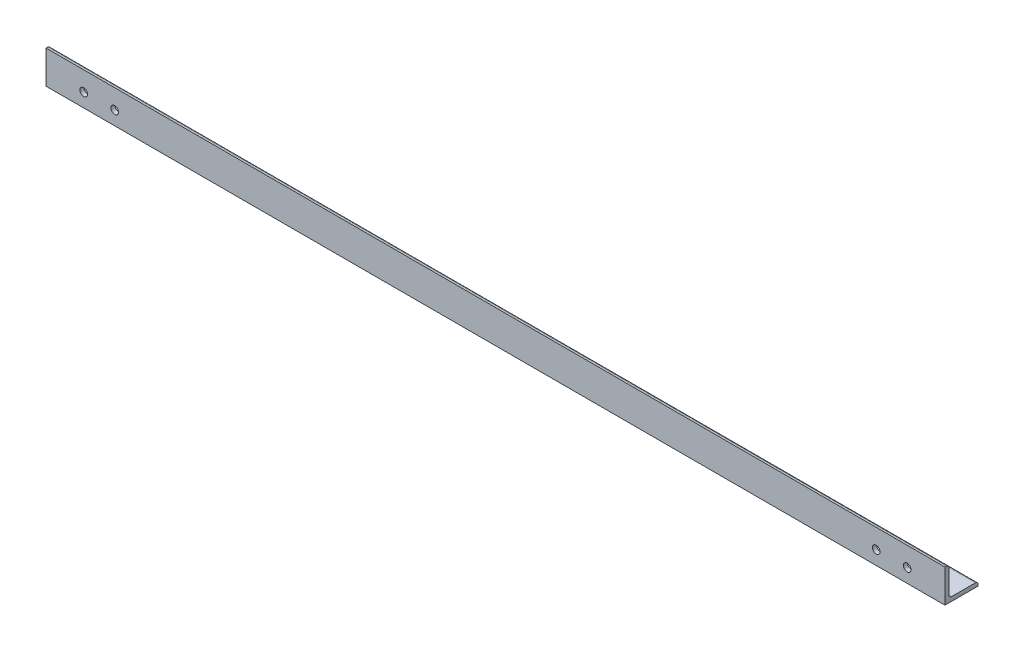
ISO-10303-21;
HEADER;
FILE_DESCRIPTION(('STEP AP214'),'2;1');
FILE_NAME('part.step','',(''),(''),'','','');
FILE_SCHEMA(('AUTOMOTIVE_DESIGN { 1 0 10303 214 1 1 1 1 }'));
ENDSEC;
DATA;
#1=APPLICATION_CONTEXT('core data for automotive mechanical design processes');
#2=APPLICATION_PROTOCOL_DEFINITION('international standard','automotive_design',2000,#1);
#3=PRODUCT_CONTEXT('',#1,'mechanical');
#4=PRODUCT('Part','Part','',(#3));
#5=PRODUCT_RELATED_PRODUCT_CATEGORY('part','',(#4));
#6=PRODUCT_DEFINITION_FORMATION('','',#4);
#7=PRODUCT_DEFINITION_CONTEXT('part definition',#1,'design');
#8=PRODUCT_DEFINITION('design','',#6,#7);
#9=PRODUCT_DEFINITION_SHAPE('','',#8);
#10=(LENGTH_UNIT() NAMED_UNIT(*) SI_UNIT(.MILLI.,.METRE.));
#11=(NAMED_UNIT(*) PLANE_ANGLE_UNIT() SI_UNIT($,.RADIAN.));
#12=(NAMED_UNIT(*) SI_UNIT($,.STERADIAN.) SOLID_ANGLE_UNIT());
#13=UNCERTAINTY_MEASURE_WITH_UNIT(LENGTH_MEASURE(1.E-05),#10,'distance_accuracy_value','');
#14=(GEOMETRIC_REPRESENTATION_CONTEXT(3) GLOBAL_UNCERTAINTY_ASSIGNED_CONTEXT((#13)) GLOBAL_UNIT_ASSIGNED_CONTEXT((#10,
#11,#12)) REPRESENTATION_CONTEXT('',''));
#15=CARTESIAN_POINT('',(0.,0.,0.));
#16=DIRECTION('',(0.,0.,1.));
#17=DIRECTION('',(1.,0.,0.));
#18=AXIS2_PLACEMENT_3D('',#15,#16,#17);
#19=CARTESIAN_POINT('',(-70.4893476114889,-310.689072168843,-671.1));
#20=DIRECTION('',(0.,-1.,0.));
#21=DIRECTION('',(0.,0.,-1.));
#22=AXIS2_PLACEMENT_3D('',#19,#20,#21);
#23=CYLINDRICAL_SURFACE('',#22,3.4);
#24=CARTESIAN_POINT('',(-70.4893476114889,-305.926572168843,-671.1));
#25=DIRECTION('',(0.,-1.,0.));
#26=DIRECTION('',(0.,0.,-1.));
#27=AXIS2_PLACEMENT_3D('',#24,#25,#26);
#28=CIRCLE('',#27,3.4);
#29=CARTESIAN_POINT('',(-70.4893476114889,-305.926572168843,-674.5));
#30=VERTEX_POINT('',#29);
#31=EDGE_CURVE('E20',#30,#30,#28,.F.);
#32=ORIENTED_EDGE('',*,*,#31,.T.);
#33=EDGE_LOOP('',(#32));
#34=FACE_BOUND('',#33,.T.);
#35=CARTESIAN_POINT('',(-70.4893476114889,-310.017902480865,-671.1));
#36=DIRECTION('',(0.,-1.,0.));
#37=DIRECTION('',(-1.,0.,0.));
#38=AXIS2_PLACEMENT_3D('',#35,#36,#37);
#39=CIRCLE('',#38,3.40000000000923);
#40=CARTESIAN_POINT('',(-73.8893476114981,-310.017902480865,-671.1));
#41=VERTEX_POINT('',#40);
#42=EDGE_CURVE('E124',#41,#41,#39,.T.);
#43=ORIENTED_EDGE('',*,*,#42,.T.);
#44=EDGE_LOOP('',(#43));
#45=FACE_BOUND('',#44,.T.);
#46=ADVANCED_FACE('F17',(#34,#45),#23,.F.);
#47=CARTESIAN_POINT('',(0.,-275.589072168843,-653.8125));
#48=DIRECTION('',(1.,0.,0.));
#49=DIRECTION('',(0.,0.,-1.));
#50=AXIS2_PLACEMENT_3D('',#47,#48,#49);
#51=CYLINDRICAL_SURFACE('',#50,3.);
#52=DIRECTION('',(1.,0.,0.));
#53=VECTOR('',#52,1.);
#54=CARTESIAN_POINT('',(551.510652388512,-272.589072168843,-653.8125));
#55=LINE('',#54,#53);
#56=CARTESIAN_POINT('',(-861.589347611489,-272.589072168843,-653.8125));
#57=VERTEX_POINT('',#56);
#58=CARTESIAN_POINT('',(174.610652388511,-272.589072168843,-653.8125));
#59=VERTEX_POINT('',#58);
#60=EDGE_CURVE('E130',#57,#59,#55,.T.);
#61=ORIENTED_EDGE('',*,*,#60,.T.);
#62=CARTESIAN_POINT('',(174.610652388511,-275.589072168843,-653.8125));
#63=DIRECTION('',(1.,0.,0.));
#64=DIRECTION('',(0.,0.,-1.));
#65=AXIS2_PLACEMENT_3D('',#62,#63,#64);
#66=CIRCLE('',#65,3.);
#67=CARTESIAN_POINT('',(174.610652388511,-275.589072168843,-656.8125));
#68=VERTEX_POINT('',#67);
#69=EDGE_CURVE('E115',#68,#59,#66,.T.);
#70=ORIENTED_EDGE('',*,*,#69,.F.);
#71=DIRECTION('',(1.,0.,0.));
#72=VECTOR('',#71,1.);
#73=CARTESIAN_POINT('',(551.510652388512,-275.589072168843,-656.8125));
#74=LINE('',#73,#72);
#75=CARTESIAN_POINT('',(-861.589347611489,-275.589072168843,-656.8125));
#76=VERTEX_POINT('',#75);
#77=EDGE_CURVE('E101',#68,#76,#74,.F.);
#78=ORIENTED_EDGE('',*,*,#77,.T.);
#79=CARTESIAN_POINT('',(-861.589347611489,-275.589072168843,-653.8125));
#80=DIRECTION('',(1.,0.,0.));
#81=DIRECTION('',(0.,0.,-1.));
#82=AXIS2_PLACEMENT_3D('',#79,#80,#81);
#83=CIRCLE('',#82,3.);
#84=EDGE_CURVE('E200',#57,#76,#83,.F.);
#85=ORIENTED_EDGE('',*,*,#84,.F.);
#86=EDGE_LOOP('',(#61,#70,#78,#85));
#87=FACE_BOUND('',#86,.T.);
#88=ADVANCED_FACE('F286',(#87),#51,.T.);
#89=CARTESIAN_POINT('',(551.510652388512,-272.589072168843,-656.8125));
#90=DIRECTION('',(0.,0.,1.));
#91=DIRECTION('',(1.,0.,0.));
#92=AXIS2_PLACEMENT_3D('',#89,#90,#91);
#93=PLANE('',#92);
#94=DIRECTION('',(0.,1.,0.));
#95=VECTOR('',#94,1.);
#96=CARTESIAN_POINT('',(174.610652388511,-310.689072168843,-656.8125));
#97=LINE('',#96,#95);
#98=CARTESIAN_POINT('',(174.610652388511,-302.926572168843,-656.8125));
#99=VERTEX_POINT('',#98);
#100=EDGE_CURVE('E107',#99,#68,#97,.T.);
#101=ORIENTED_EDGE('',*,*,#100,.F.);
#102=DIRECTION('',(-1.,0.,0.));
#103=VECTOR('',#102,1.);
#104=CARTESIAN_POINT('',(0.,-302.926572168843,-656.8125));
#105=LINE('',#104,#103);
#106=CARTESIAN_POINT('',(-861.589347611489,-302.926572168843,-656.8125));
#107=VERTEX_POINT('',#106);
#108=EDGE_CURVE('E93',#99,#107,#105,.T.);
#109=ORIENTED_EDGE('',*,*,#108,.T.);
#110=DIRECTION('',(0.,1.,0.));
#111=VECTOR('',#110,1.);
#112=CARTESIAN_POINT('',(-861.589347611489,-310.689072168843,-656.8125));
#113=LINE('',#112,#111);
#114=EDGE_CURVE('E199',#76,#107,#113,.F.);
#115=ORIENTED_EDGE('',*,*,#114,.F.);
#116=ORIENTED_EDGE('',*,*,#77,.F.);
#117=EDGE_LOOP('',(#101,#109,#115,#116));
#118=FACE_BOUND('',#117,.T.);
#119=CARTESIAN_POINT('',(95.3856523885109,-294.826572168843,-656.8125));
#120=DIRECTION('',(0.,0.,-1.));
#121=DIRECTION('',(-1.,0.,0.));
#122=AXIS2_PLACEMENT_3D('',#119,#120,#121);
#123=CIRCLE('',#122,4.4);
#124=CARTESIAN_POINT('',(90.9856523885109,-294.826572168843,-656.8125));
#125=VERTEX_POINT('',#124);
#126=EDGE_CURVE('E134',#125,#125,#123,.F.);
#127=ORIENTED_EDGE('',*,*,#126,.T.);
#128=EDGE_LOOP('',(#127));
#129=FACE_BOUND('',#128,.T.);
#130=CARTESIAN_POINT('',(131.135652388511,-294.826572168843,-656.8125));
#131=DIRECTION('',(0.,0.,-1.));
#132=DIRECTION('',(-1.,0.,0.));
#133=AXIS2_PLACEMENT_3D('',#130,#131,#132);
#134=CIRCLE('',#133,4.4);
#135=CARTESIAN_POINT('',(126.735652388511,-294.826572168843,-656.8125));
#136=VERTEX_POINT('',#135);
#137=EDGE_CURVE('E127',#136,#136,#134,.F.);
#138=ORIENTED_EDGE('',*,*,#137,.T.);
#139=EDGE_LOOP('',(#138));
#140=FACE_BOUND('',#139,.T.);
#141=CARTESIAN_POINT('',(-782.364347611488,-294.826572168843,-656.8125));
#142=DIRECTION('',(0.,0.,1.));
#143=DIRECTION('',(1.,0.,0.));
#144=AXIS2_PLACEMENT_3D('',#141,#142,#143);
#145=CIRCLE('',#144,4.4);
#146=CARTESIAN_POINT('',(-777.964347611488,-294.826572168843,-656.8125));
#147=VERTEX_POINT('',#146);
#148=EDGE_CURVE('E210',#147,#147,#145,.T.);
#149=ORIENTED_EDGE('',*,*,#148,.T.);
#150=EDGE_LOOP('',(#149));
#151=FACE_BOUND('',#150,.T.);
#152=CARTESIAN_POINT('',(-818.114347611488,-294.826572168843,-656.8125));
#153=DIRECTION('',(0.,0.,1.));
#154=DIRECTION('',(1.,0.,0.));
#155=AXIS2_PLACEMENT_3D('',#152,#153,#154);
#156=CIRCLE('',#155,4.4);
#157=CARTESIAN_POINT('',(-813.714347611488,-294.826572168843,-656.8125));
#158=VERTEX_POINT('',#157);
#159=EDGE_CURVE('E213',#158,#158,#156,.T.);
#160=ORIENTED_EDGE('',*,*,#159,.T.);
#161=EDGE_LOOP('',(#160));
#162=FACE_BOUND('',#161,.T.);
#163=ADVANCED_FACE('F112',(#118,#129,#140,#151,#162),#93,.F.);
#164=CARTESIAN_POINT('',(0.,-302.926572168843,-659.8125));
#165=DIRECTION('',(-1.,0.,0.));
#166=DIRECTION('',(0.,0.,1.));
#167=AXIS2_PLACEMENT_3D('',#164,#165,#166);
#168=CYLINDRICAL_SURFACE('',#167,3.);
#169=CARTESIAN_POINT('',(-861.589347611489,-302.926572168843,-659.8125));
#170=DIRECTION('',(-1.,0.,0.));
#171=DIRECTION('',(0.,0.,1.));
#172=AXIS2_PLACEMENT_3D('',#169,#170,#171);
#173=CIRCLE('',#172,3.);
#174=CARTESIAN_POINT('',(-861.589347611489,-305.926572168843,-659.8125));
#175=VERTEX_POINT('',#174);
#176=EDGE_CURVE('E97',#107,#175,#173,.F.);
#177=ORIENTED_EDGE('',*,*,#176,.F.);
#178=ORIENTED_EDGE('',*,*,#108,.F.);
#179=CARTESIAN_POINT('',(174.610652388511,-302.926572168843,-659.8125));
#180=DIRECTION('',(-1.,0.,0.));
#181=DIRECTION('',(0.,0.,1.));
#182=AXIS2_PLACEMENT_3D('',#179,#180,#181);
#183=CIRCLE('',#182,3.);
#184=CARTESIAN_POINT('',(174.610652388511,-305.926572168843,-659.8125));
#185=VERTEX_POINT('',#184);
#186=EDGE_CURVE('E96',#185,#99,#183,.T.);
#187=ORIENTED_EDGE('',*,*,#186,.F.);
#188=DIRECTION('',(1.,0.,0.));
#189=VECTOR('',#188,1.);
#190=CARTESIAN_POINT('',(551.510652388512,-305.926572168843,-659.8125));
#191=LINE('',#190,#189);
#192=EDGE_CURVE('E86',#185,#175,#191,.F.);
#193=ORIENTED_EDGE('',*,*,#192,.T.);
#194=EDGE_LOOP('',(#177,#178,#187,#193));
#195=FACE_BOUND('',#194,.T.);
#196=ADVANCED_FACE('F95',(#195),#168,.F.);
#197=CARTESIAN_POINT('',(551.510652388512,-305.926572168843,-656.8125));
#198=DIRECTION('',(0.,-1.,0.));
#199=DIRECTION('',(0.,0.,-1.));
#200=AXIS2_PLACEMENT_3D('',#197,#198,#199);
#201=PLANE('',#200);
#202=DIRECTION('',(0.,0.,-1.));
#203=VECTOR('',#202,1.);
#204=CARTESIAN_POINT('',(174.610652388511,-305.926572168843,-270.05));
#205=LINE('',#204,#203);
#206=CARTESIAN_POINT('',(174.610652388511,-305.926572168843,-687.15));
#207=VERTEX_POINT('',#206);
#208=EDGE_CURVE('E110',#207,#185,#205,.F.);
#209=ORIENTED_EDGE('',*,*,#208,.F.);
#210=DIRECTION('',(-1.,0.,0.));
#211=VECTOR('',#210,1.);
#212=CARTESIAN_POINT('',(0.,-305.926572168843,-687.15));
#213=LINE('',#212,#211);
#214=CARTESIAN_POINT('',(-861.589347611489,-305.926572168843,-687.15));
#215=VERTEX_POINT('',#214);
#216=EDGE_CURVE('E125',#215,#207,#213,.F.);
#217=ORIENTED_EDGE('',*,*,#216,.F.);
#218=DIRECTION('',(0.,0.,1.));
#219=VECTOR('',#218,1.);
#220=CARTESIAN_POINT('',(-861.589347611489,-305.926572168843,-793.95));
#221=LINE('',#220,#219);
#222=EDGE_CURVE('E197',#175,#215,#221,.F.);
#223=ORIENTED_EDGE('',*,*,#222,.F.);
#224=ORIENTED_EDGE('',*,*,#192,.F.);
#225=EDGE_LOOP('',(#209,#217,#223,#224));
#226=FACE_BOUND('',#225,.T.);
#227=CARTESIAN_POINT('',(-800.239347611488,-305.926572168843,-671.1));
#228=DIRECTION('',(0.,-1.,0.));
#229=DIRECTION('',(0.,0.,-1.));
#230=AXIS2_PLACEMENT_3D('',#227,#228,#229);
#231=CIRCLE('',#230,5.);
#232=CARTESIAN_POINT('',(-800.239347611488,-305.926572168843,-676.1));
#233=VERTEX_POINT('',#232);
#234=EDGE_CURVE('E175',#233,#233,#231,.T.);
#235=ORIENTED_EDGE('',*,*,#234,.T.);
#236=EDGE_LOOP('',(#235));
#237=FACE_BOUND('',#236,.T.);
#238=ORIENTED_EDGE('',*,*,#31,.F.);
#239=EDGE_LOOP('',(#238));
#240=FACE_BOUND('',#239,.T.);
#241=CARTESIAN_POINT('',(113.260652388512,-305.926572168843,-671.1));
#242=DIRECTION('',(0.,-1.,0.));
#243=DIRECTION('',(0.,0.,-1.));
#244=AXIS2_PLACEMENT_3D('',#241,#242,#243);
#245=CIRCLE('',#244,5.);
#246=CARTESIAN_POINT('',(113.260652388512,-305.926572168843,-676.1));
#247=VERTEX_POINT('',#246);
#248=EDGE_CURVE('E133',#247,#247,#245,.T.);
#249=ORIENTED_EDGE('',*,*,#248,.T.);
#250=EDGE_LOOP('',(#249));
#251=FACE_BOUND('',#250,.T.);
#252=ADVANCED_FACE('F279',(#226,#237,#240,#251),#201,.F.);
#253=CARTESIAN_POINT('',(0.,-308.926572168843,-687.15));
#254=DIRECTION('',(-1.,0.,0.));
#255=DIRECTION('',(0.,0.,1.));
#256=AXIS2_PLACEMENT_3D('',#253,#254,#255);
#257=CYLINDRICAL_SURFACE('',#256,3.);
#258=DIRECTION('',(1.,0.,0.));
#259=VECTOR('',#258,1.);
#260=CARTESIAN_POINT('',(551.510652388512,-308.926572168843,-690.15));
#261=LINE('',#260,#259);
#262=CARTESIAN_POINT('',(174.610652388511,-308.926572168843,-690.15));
#263=VERTEX_POINT('',#262);
#264=CARTESIAN_POINT('',(-861.589347611489,-308.926572168843,-690.15));
#265=VERTEX_POINT('',#264);
#266=EDGE_CURVE('E145',#263,#265,#261,.F.);
#267=ORIENTED_EDGE('',*,*,#266,.T.);
#268=CARTESIAN_POINT('',(-861.589347611489,-308.926572168843,-687.15));
#269=DIRECTION('',(-1.,0.,0.));
#270=DIRECTION('',(0.,0.,1.));
#271=AXIS2_PLACEMENT_3D('',#268,#269,#270);
#272=CIRCLE('',#271,3.);
#273=EDGE_CURVE('E194',#215,#265,#272,.T.);
#274=ORIENTED_EDGE('',*,*,#273,.F.);
#275=ORIENTED_EDGE('',*,*,#216,.T.);
#276=CARTESIAN_POINT('',(174.610652388511,-308.926572168843,-687.15));
#277=DIRECTION('',(-1.,0.,0.));
#278=DIRECTION('',(0.,0.,1.));
#279=AXIS2_PLACEMENT_3D('',#276,#277,#278);
#280=CIRCLE('',#279,3.);
#281=EDGE_CURVE('E160',#263,#207,#280,.F.);
#282=ORIENTED_EDGE('',*,*,#281,.F.);
#283=EDGE_LOOP('',(#267,#274,#275,#282));
#284=FACE_BOUND('',#283,.T.);
#285=ADVANCED_FACE('F224',(#284),#257,.T.);
#286=CARTESIAN_POINT('',(131.135652388511,-294.826572168843,-648.2399976));
#287=DIRECTION('',(0.,0.,-1.));
#288=DIRECTION('',(-1.,0.,0.));
#289=AXIS2_PLACEMENT_3D('',#286,#287,#288);
#290=CYLINDRICAL_SURFACE('',#289,4.4);
#291=ORIENTED_EDGE('',*,*,#137,.F.);
#292=EDGE_LOOP('',(#291));
#293=FACE_BOUND('',#292,.T.);
#294=CARTESIAN_POINT('',(131.135652388511,-294.826572168843,-652.05));
#295=DIRECTION('',(0.,0.,-1.));
#296=DIRECTION('',(-1.,0.,0.));
#297=AXIS2_PLACEMENT_3D('',#294,#295,#296);
#298=CIRCLE('',#297,4.4);
#299=CARTESIAN_POINT('',(126.735652388511,-294.826572168843,-652.05));
#300=VERTEX_POINT('',#299);
#301=EDGE_CURVE('E191',#300,#300,#298,.F.);
#302=ORIENTED_EDGE('',*,*,#301,.T.);
#303=EDGE_LOOP('',(#302));
#304=FACE_BOUND('',#303,.T.);
#305=ADVANCED_FACE('F220',(#293,#304),#290,.F.);
#306=CARTESIAN_POINT('',(-818.114347611488,-294.826572168843,-693.9600024));
#307=DIRECTION('',(0.,0.,1.));
#308=DIRECTION('',(1.,0.,0.));
#309=AXIS2_PLACEMENT_3D('',#306,#307,#308);
#310=CYLINDRICAL_SURFACE('',#309,4.4);
#311=CARTESIAN_POINT('',(-818.114347611488,-294.826572168843,-652.05));
#312=DIRECTION('',(0.,0.,1.));
#313=DIRECTION('',(1.,0.,0.));
#314=AXIS2_PLACEMENT_3D('',#311,#312,#313);
#315=CIRCLE('',#314,4.4);
#316=CARTESIAN_POINT('',(-813.714347611488,-294.826572168843,-652.05));
#317=VERTEX_POINT('',#316);
#318=EDGE_CURVE('E188',#317,#317,#315,.T.);
#319=ORIENTED_EDGE('',*,*,#318,.T.);
#320=EDGE_LOOP('',(#319));
#321=FACE_BOUND('',#320,.T.);
#322=ORIENTED_EDGE('',*,*,#159,.F.);
#323=EDGE_LOOP('',(#322));
#324=FACE_BOUND('',#323,.T.);
#325=ADVANCED_FACE('F223',(#321,#324),#310,.F.);
#326=CARTESIAN_POINT('',(-782.364347611488,-294.826572168843,-693.9600024));
#327=DIRECTION('',(0.,0.,1.));
#328=DIRECTION('',(1.,0.,0.));
#329=AXIS2_PLACEMENT_3D('',#326,#327,#328);
#330=CYLINDRICAL_SURFACE('',#329,4.4);
#331=CARTESIAN_POINT('',(-782.364347611488,-294.826572168843,-652.05));
#332=DIRECTION('',(0.,0.,1.));
#333=DIRECTION('',(1.,0.,0.));
#334=AXIS2_PLACEMENT_3D('',#331,#332,#333);
#335=CIRCLE('',#334,4.4);
#336=CARTESIAN_POINT('',(-777.964347611488,-294.826572168843,-652.05));
#337=VERTEX_POINT('',#336);
#338=EDGE_CURVE('E185',#337,#337,#335,.T.);
#339=ORIENTED_EDGE('',*,*,#338,.T.);
#340=EDGE_LOOP('',(#339));
#341=FACE_BOUND('',#340,.T.);
#342=ORIENTED_EDGE('',*,*,#148,.F.);
#343=EDGE_LOOP('',(#342));
#344=FACE_BOUND('',#343,.T.);
#345=ADVANCED_FACE('F269',(#341,#344),#330,.F.);
#346=CARTESIAN_POINT('',(95.3856523885109,-294.826572168843,-648.2399976));
#347=DIRECTION('',(0.,0.,-1.));
#348=DIRECTION('',(-1.,0.,0.));
#349=AXIS2_PLACEMENT_3D('',#346,#347,#348);
#350=CYLINDRICAL_SURFACE('',#349,4.4);
#351=ORIENTED_EDGE('',*,*,#126,.F.);
#352=EDGE_LOOP('',(#351));
#353=FACE_BOUND('',#352,.T.);
#354=CARTESIAN_POINT('',(95.3856523885109,-294.826572168843,-652.05));
#355=DIRECTION('',(0.,0.,-1.));
#356=DIRECTION('',(-1.,0.,0.));
#357=AXIS2_PLACEMENT_3D('',#354,#355,#356);
#358=CIRCLE('',#357,4.4);
#359=CARTESIAN_POINT('',(90.9856523885109,-294.826572168843,-652.05));
#360=VERTEX_POINT('',#359);
#361=EDGE_CURVE('E170',#360,#360,#358,.F.);
#362=ORIENTED_EDGE('',*,*,#361,.T.);
#363=EDGE_LOOP('',(#362));
#364=FACE_BOUND('',#363,.T.);
#365=ADVANCED_FACE('F265',(#353,#364),#350,.F.);
#366=CARTESIAN_POINT('',(551.510652388512,-272.589072168843,-652.05));
#367=DIRECTION('',(0.,-1.,0.));
#368=DIRECTION('',(0.,0.,-1.));
#369=AXIS2_PLACEMENT_3D('',#366,#367,#368);
#370=PLANE('',#369);
#371=DIRECTION('',(0.,0.,1.));
#372=VECTOR('',#371,1.);
#373=CARTESIAN_POINT('',(-861.589347611489,-272.589072168843,-793.95));
#374=LINE('',#373,#372);
#375=CARTESIAN_POINT('',(-861.589347611489,-272.589072168843,-652.05));
#376=VERTEX_POINT('',#375);
#377=EDGE_CURVE('E202',#376,#57,#374,.F.);
#378=ORIENTED_EDGE('',*,*,#377,.F.);
#379=DIRECTION('',(-1.,0.,0.));
#380=VECTOR('',#379,1.);
#381=CARTESIAN_POINT('',(513.810652388512,-272.589072168843,-652.05));
#382=LINE('',#381,#380);
#383=CARTESIAN_POINT('',(174.610652388511,-272.589072168843,-652.05));
#384=VERTEX_POINT('',#383);
#385=EDGE_CURVE('E135',#376,#384,#382,.F.);
#386=ORIENTED_EDGE('',*,*,#385,.T.);
#387=DIRECTION('',(0.,0.,-1.));
#388=VECTOR('',#387,1.);
#389=CARTESIAN_POINT('',(174.610652388511,-272.589072168843,-270.05));
#390=LINE('',#389,#388);
#391=EDGE_CURVE('E117',#59,#384,#390,.F.);
#392=ORIENTED_EDGE('',*,*,#391,.F.);
#393=ORIENTED_EDGE('',*,*,#60,.F.);
#394=EDGE_LOOP('',(#378,#386,#392,#393));
#395=FACE_BOUND('',#394,.T.);
#396=ADVANCED_FACE('F261',(#395),#370,.F.);
#397=CARTESIAN_POINT('',(113.260652388512,-268.779069768843,-671.1));
#398=DIRECTION('',(0.,-1.,0.));
#399=DIRECTION('',(0.,0.,-1.));
#400=AXIS2_PLACEMENT_3D('',#397,#398,#399);
#401=CYLINDRICAL_SURFACE('',#400,5.);
#402=CARTESIAN_POINT('',(113.260652388512,-310.689072168843,-671.1));
#403=DIRECTION('',(0.,-1.,0.));
#404=DIRECTION('',(0.,0.,-1.));
#405=AXIS2_PLACEMENT_3D('',#402,#403,#404);
#406=CIRCLE('',#405,5.);
#407=CARTESIAN_POINT('',(113.260652388512,-310.689072168843,-676.1));
#408=VERTEX_POINT('',#407);
#409=EDGE_CURVE('E138',#408,#408,#406,.T.);
#410=ORIENTED_EDGE('',*,*,#409,.T.);
#411=EDGE_LOOP('',(#410));
#412=FACE_BOUND('',#411,.T.);
#413=ORIENTED_EDGE('',*,*,#248,.F.);
#414=EDGE_LOOP('',(#413));
#415=FACE_BOUND('',#414,.T.);
#416=ADVANCED_FACE('F257',(#412,#415),#401,.F.);
#417=CARTESIAN_POINT('',(-800.239347611488,-268.779069768843,-671.1));
#418=DIRECTION('',(0.,-1.,0.));
#419=DIRECTION('',(0.,0.,-1.));
#420=AXIS2_PLACEMENT_3D('',#417,#418,#419);
#421=CYLINDRICAL_SURFACE('',#420,5.);
#422=CARTESIAN_POINT('',(-800.239347611488,-310.689072168843,-671.1));
#423=DIRECTION('',(0.,-1.,0.));
#424=DIRECTION('',(0.,0.,-1.));
#425=AXIS2_PLACEMENT_3D('',#422,#423,#424);
#426=CIRCLE('',#425,5.);
#427=CARTESIAN_POINT('',(-800.239347611488,-310.689072168843,-676.1));
#428=VERTEX_POINT('',#427);
#429=EDGE_CURVE('E178',#428,#428,#426,.T.);
#430=ORIENTED_EDGE('',*,*,#429,.T.);
#431=EDGE_LOOP('',(#430));
#432=FACE_BOUND('',#431,.T.);
#433=ORIENTED_EDGE('',*,*,#234,.F.);
#434=EDGE_LOOP('',(#433));
#435=FACE_BOUND('',#434,.T.);
#436=ADVANCED_FACE('F253',(#432,#435),#421,.F.);
#437=CARTESIAN_POINT('',(-70.4893476114889,-310.689072168771,-671.1));
#438=DIRECTION('',(0.,-1.,0.));
#439=DIRECTION('',(0.,0.,-1.));
#440=AXIS2_PLACEMENT_3D('',#437,#438,#439);
#441=CONICAL_SURFACE('',#440,4.56249999997321,1.04719755120111);
#442=CARTESIAN_POINT('',(-70.4893476114889,-310.689072168765,-671.1));
#443=DIRECTION('',(0.,-1.,0.));
#444=DIRECTION('',(0.,0.,-1.));
#445=AXIS2_PLACEMENT_3D('',#442,#443,#444);
#446=CIRCLE('',#445,4.56249999996317);
#447=CARTESIAN_POINT('',(-70.4893476114889,-310.689072168765,-675.662499999963));
#448=VERTEX_POINT('',#447);
#449=EDGE_CURVE('E165',#448,#448,#446,.T.);
#450=ORIENTED_EDGE('',*,*,#449,.T.);
#451=EDGE_LOOP('',(#450));
#452=FACE_BOUND('',#451,.T.);
#453=ORIENTED_EDGE('',*,*,#42,.F.);
#454=EDGE_LOOP('',(#453));
#455=FACE_BOUND('',#454,.T.);
#456=ADVANCED_FACE('F250',(#452,#455),#441,.F.);
#457=CARTESIAN_POINT('',(174.610652388511,-310.689072168843,-270.05));
#458=DIRECTION('',(1.,0.,0.));
#459=DIRECTION('',(0.,0.,-1.));
#460=AXIS2_PLACEMENT_3D('',#457,#458,#459);
#461=PLANE('',#460);
#462=DIRECTION('',(0.,1.,0.));
#463=VECTOR('',#462,1.);
#464=CARTESIAN_POINT('',(174.610652388511,-305.926572168843,-690.15));
#465=LINE('',#464,#463);
#466=CARTESIAN_POINT('',(174.610652388511,-310.689072168843,-690.15));
#467=VERTEX_POINT('',#466);
#468=EDGE_CURVE('E148',#467,#263,#465,.T.);
#469=ORIENTED_EDGE('',*,*,#468,.T.);
#470=ORIENTED_EDGE('',*,*,#281,.T.);
#471=ORIENTED_EDGE('',*,*,#208,.T.);
#472=ORIENTED_EDGE('',*,*,#186,.T.);
#473=ORIENTED_EDGE('',*,*,#100,.T.);
#474=ORIENTED_EDGE('',*,*,#69,.T.);
#475=ORIENTED_EDGE('',*,*,#391,.T.);
#476=DIRECTION('',(0.,1.,0.));
#477=VECTOR('',#476,1.);
#478=CARTESIAN_POINT('',(174.610652388511,-310.689072168843,-652.05));
#479=LINE('',#478,#477);
#480=CARTESIAN_POINT('',(174.610652388511,-310.689072168843,-652.05));
#481=VERTEX_POINT('',#480);
#482=EDGE_CURVE('E142',#384,#481,#479,.F.);
#483=ORIENTED_EDGE('',*,*,#482,.T.);
#484=DIRECTION('',(0.,0.,1.));
#485=VECTOR('',#484,1.);
#486=CARTESIAN_POINT('',(174.610652388511,-310.689072168843,-690.15));
#487=LINE('',#486,#485);
#488=EDGE_CURVE('E156',#481,#467,#487,.F.);
#489=ORIENTED_EDGE('',*,*,#488,.T.);
#490=EDGE_LOOP('',(#469,#470,#471,#472,#473,#474,#475,#483,#489));
#491=FACE_BOUND('',#490,.T.);
#492=ADVANCED_FACE('F106',(#491),#461,.T.);
#493=CARTESIAN_POINT('',(551.510652388512,-305.926572168843,-690.15));
#494=DIRECTION('',(0.,0.,1.));
#495=DIRECTION('',(1.,0.,0.));
#496=AXIS2_PLACEMENT_3D('',#493,#494,#495);
#497=PLANE('',#496);
#498=DIRECTION('',(0.,1.,0.));
#499=VECTOR('',#498,1.);
#500=CARTESIAN_POINT('',(-861.589347611489,-310.689072168843,-690.15));
#501=LINE('',#500,#499);
#502=CARTESIAN_POINT('',(-861.589347611489,-310.689072168843,-690.15));
#503=VERTEX_POINT('',#502);
#504=EDGE_CURVE('E147',#265,#503,#501,.F.);
#505=ORIENTED_EDGE('',*,*,#504,.F.);
#506=ORIENTED_EDGE('',*,*,#266,.F.);
#507=ORIENTED_EDGE('',*,*,#468,.F.);
#508=DIRECTION('',(1.,0.,0.));
#509=VECTOR('',#508,1.);
#510=CARTESIAN_POINT('',(551.510652388512,-310.689072168843,-690.15));
#511=LINE('',#510,#509);
#512=EDGE_CURVE('E151',#467,#503,#511,.F.);
#513=ORIENTED_EDGE('',*,*,#512,.T.);
#514=EDGE_LOOP('',(#505,#506,#507,#513));
#515=FACE_BOUND('',#514,.T.);
#516=ADVANCED_FACE('F240',(#515),#497,.F.);
#517=CARTESIAN_POINT('',(-861.589347611489,-310.689072168843,-793.95));
#518=DIRECTION('',(-1.,0.,0.));
#519=DIRECTION('',(0.,0.,1.));
#520=AXIS2_PLACEMENT_3D('',#517,#518,#519);
#521=PLANE('',#520);
#522=ORIENTED_EDGE('',*,*,#222,.T.);
#523=ORIENTED_EDGE('',*,*,#273,.T.);
#524=ORIENTED_EDGE('',*,*,#504,.T.);
#525=DIRECTION('',(0.,0.,1.));
#526=VECTOR('',#525,1.);
#527=CARTESIAN_POINT('',(-861.589347611489,-310.689072168843,-690.15));
#528=LINE('',#527,#526);
#529=CARTESIAN_POINT('',(-861.589347611489,-310.689072168843,-652.05));
#530=VERTEX_POINT('',#529);
#531=EDGE_CURVE('E26',#503,#530,#528,.T.);
#532=ORIENTED_EDGE('',*,*,#531,.T.);
#533=DIRECTION('',(0.,1.,0.));
#534=VECTOR('',#533,1.);
#535=CARTESIAN_POINT('',(-861.589347611489,-310.689072168843,-652.05));
#536=LINE('',#535,#534);
#537=EDGE_CURVE('E34',#530,#376,#536,.T.);
#538=ORIENTED_EDGE('',*,*,#537,.T.);
#539=ORIENTED_EDGE('',*,*,#377,.T.);
#540=ORIENTED_EDGE('',*,*,#84,.T.);
#541=ORIENTED_EDGE('',*,*,#114,.T.);
#542=ORIENTED_EDGE('',*,*,#176,.T.);
#543=EDGE_LOOP('',(#522,#523,#524,#532,#538,#539,#540,#541,#542));
#544=FACE_BOUND('',#543,.T.);
#545=ADVANCED_FACE('F231',(#544),#521,.T.);
#546=CARTESIAN_POINT('',(513.810652388512,-310.689072168843,-652.05));
#547=DIRECTION('',(0.,0.,-1.));
#548=DIRECTION('',(-1.,0.,0.));
#549=AXIS2_PLACEMENT_3D('',#546,#547,#548);
#550=PLANE('',#549);
#551=ORIENTED_EDGE('',*,*,#537,.F.);
#552=DIRECTION('',(1.,0.,0.));
#553=VECTOR('',#552,1.);
#554=CARTESIAN_POINT('',(551.510652388512,-310.689072168843,-652.05));
#555=LINE('',#554,#553);
#556=EDGE_CURVE('E11',#530,#481,#555,.T.);
#557=ORIENTED_EDGE('',*,*,#556,.T.);
#558=ORIENTED_EDGE('',*,*,#482,.F.);
#559=ORIENTED_EDGE('',*,*,#385,.F.);
#560=EDGE_LOOP('',(#551,#557,#558,#559));
#561=FACE_BOUND('',#560,.T.);
#562=ORIENTED_EDGE('',*,*,#361,.F.);
#563=EDGE_LOOP('',(#562));
#564=FACE_BOUND('',#563,.T.);
#565=ORIENTED_EDGE('',*,*,#338,.F.);
#566=EDGE_LOOP('',(#565));
#567=FACE_BOUND('',#566,.T.);
#568=ORIENTED_EDGE('',*,*,#318,.F.);
#569=EDGE_LOOP('',(#568));
#570=FACE_BOUND('',#569,.T.);
#571=ORIENTED_EDGE('',*,*,#301,.F.);
#572=EDGE_LOOP('',(#571));
#573=FACE_BOUND('',#572,.T.);
#574=ADVANCED_FACE('F228',(#561,#564,#567,#570,#573),#550,.F.);
#575=CARTESIAN_POINT('',(551.510652388512,-310.689072168843,-690.15));
#576=DIRECTION('',(0.,1.,0.));
#577=DIRECTION('',(0.,0.,1.));
#578=AXIS2_PLACEMENT_3D('',#575,#576,#577);
#579=PLANE('',#578);
#580=ORIENTED_EDGE('',*,*,#531,.F.);
#581=ORIENTED_EDGE('',*,*,#512,.F.);
#582=ORIENTED_EDGE('',*,*,#488,.F.);
#583=ORIENTED_EDGE('',*,*,#556,.F.);
#584=EDGE_LOOP('',(#580,#581,#582,#583));
#585=FACE_BOUND('',#584,.T.);
#586=ORIENTED_EDGE('',*,*,#449,.F.);
#587=EDGE_LOOP('',(#586));
#588=FACE_BOUND('',#587,.T.);
#589=ORIENTED_EDGE('',*,*,#429,.F.);
#590=EDGE_LOOP('',(#589));
#591=FACE_BOUND('',#590,.T.);
#592=ORIENTED_EDGE('',*,*,#409,.F.);
#593=EDGE_LOOP('',(#592));
#594=FACE_BOUND('',#593,.T.);
#595=ADVANCED_FACE('F230',(#585,#588,#591,#594),#579,.F.);
#596=CLOSED_SHELL('',(#46,#88,#163,#196,#252,#285,#305,#325,#345,#365,#396,#416,#436,#456,#492,
#516,#545,#574,#595));
#597=MANIFOLD_SOLID_BREP('B1',#596);
#598=ADVANCED_BREP_SHAPE_REPRESENTATION('',(#18,#597),#14);
#599=SHAPE_DEFINITION_REPRESENTATION(#9,#598);
ENDSEC;
END-ISO-10303-21;
